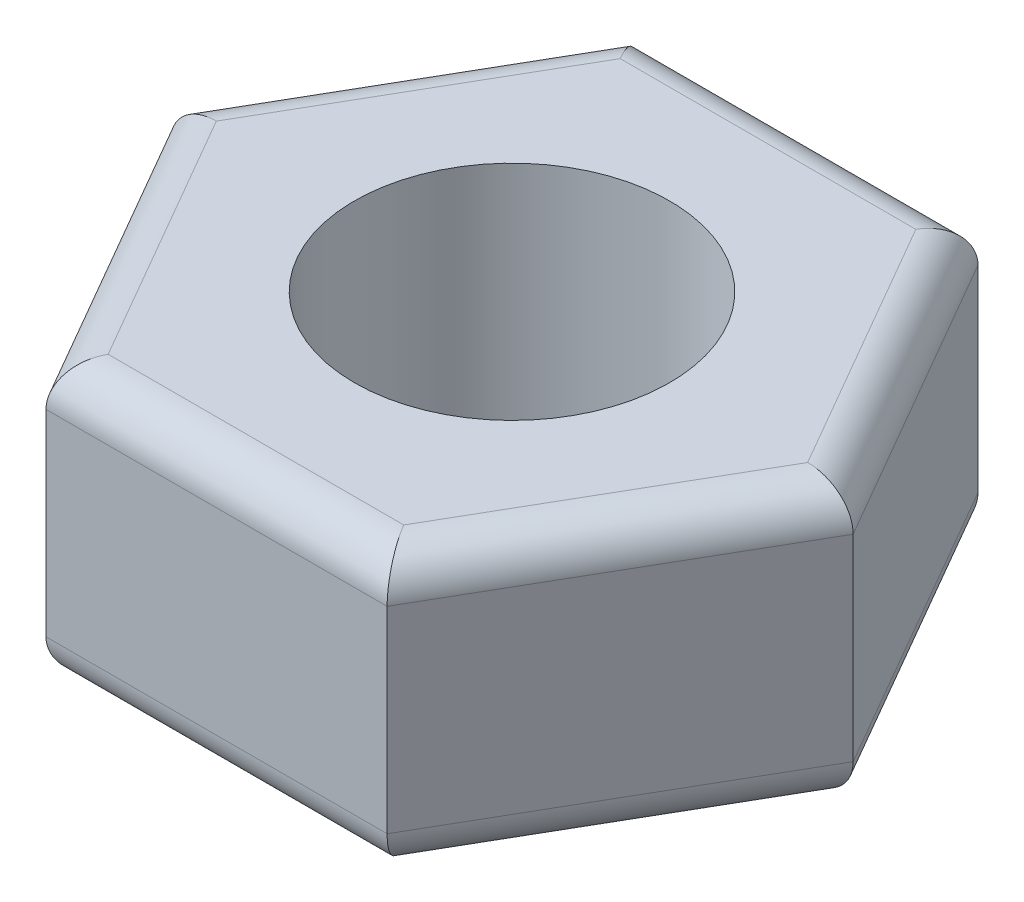
ISO-10303-21;
HEADER;
FILE_DESCRIPTION(('STEP AP214'),'2;1');
FILE_NAME('part.step','',(''),(''),'','','');
FILE_SCHEMA(('AUTOMOTIVE_DESIGN { 1 0 10303 214 1 1 1 1 }'));
ENDSEC;
DATA;
#1=APPLICATION_CONTEXT('core data for automotive mechanical design processes');
#2=APPLICATION_PROTOCOL_DEFINITION('international standard','automotive_design',2000,#1);
#3=PRODUCT_CONTEXT('',#1,'mechanical');
#4=PRODUCT('Part','Part','',(#3));
#5=PRODUCT_RELATED_PRODUCT_CATEGORY('part','',(#4));
#6=PRODUCT_DEFINITION_FORMATION('','',#4);
#7=PRODUCT_DEFINITION_CONTEXT('part definition',#1,'design');
#8=PRODUCT_DEFINITION('design','',#6,#7);
#9=PRODUCT_DEFINITION_SHAPE('','',#8);
#10=(LENGTH_UNIT() NAMED_UNIT(*) SI_UNIT(.MILLI.,.METRE.));
#11=(NAMED_UNIT(*) PLANE_ANGLE_UNIT() SI_UNIT($,.RADIAN.));
#12=(NAMED_UNIT(*) SI_UNIT($,.STERADIAN.) SOLID_ANGLE_UNIT());
#13=UNCERTAINTY_MEASURE_WITH_UNIT(LENGTH_MEASURE(1.E-05),#10,'distance_accuracy_value','');
#14=(GEOMETRIC_REPRESENTATION_CONTEXT(3) GLOBAL_UNCERTAINTY_ASSIGNED_CONTEXT((#13)) GLOBAL_UNIT_ASSIGNED_CONTEXT((#10,
#11,#12)) REPRESENTATION_CONTEXT('',''));
#15=CARTESIAN_POINT('',(0.,0.,0.));
#16=DIRECTION('',(0.,0.,1.));
#17=DIRECTION('',(1.,0.,0.));
#18=AXIS2_PLACEMENT_3D('',#15,#16,#17);
#19=CARTESIAN_POINT('',(0.,3.5,0.));
#20=DIRECTION('',(0.,1.,0.));
#21=DIRECTION('',(0.,0.,1.));
#22=AXIS2_PLACEMENT_3D('',#19,#20,#21);
#23=PLANE('',#22);
#24=DIRECTION('',(-1.,0.,0.));
#25=VECTOR('',#24,1.);
#26=CARTESIAN_POINT('',(-2.1650635094611,3.5,-3.25));
#27=LINE('',#26,#25);
#28=CARTESIAN_POINT('',(1.87638837486628,3.5,-3.25));
#29=VERTEX_POINT('',#28);
#30=CARTESIAN_POINT('',(-1.87638837486628,3.5,-3.25));
#31=VERTEX_POINT('',#30);
#32=EDGE_CURVE('E45',#29,#31,#27,.T.);
#33=ORIENTED_EDGE('',*,*,#32,.T.);
#34=DIRECTION('',(-0.5,0.,0.866025403784439));
#35=VECTOR('',#34,1.);
#36=CARTESIAN_POINT('',(-3.89711431702997,3.5,0.250000000000001));
#37=LINE('',#36,#35);
#38=CARTESIAN_POINT('',(-3.75277674973256,3.5,0.));
#39=VERTEX_POINT('',#38);
#40=EDGE_CURVE('E11',#31,#39,#37,.T.);
#41=ORIENTED_EDGE('',*,*,#40,.T.);
#42=DIRECTION('',(0.5,0.,0.866025403784438));
#43=VECTOR('',#42,1.);
#44=CARTESIAN_POINT('',(-1.73205080756887,3.5,3.5));
#45=LINE('',#44,#43);
#46=CARTESIAN_POINT('',(-1.87638837486628,3.5,3.25));
#47=VERTEX_POINT('',#46);
#48=EDGE_CURVE('E261',#39,#47,#45,.T.);
#49=ORIENTED_EDGE('',*,*,#48,.T.);
#50=DIRECTION('',(1.,0.,0.));
#51=VECTOR('',#50,1.);
#52=CARTESIAN_POINT('',(2.1650635094611,3.5,3.25));
#53=LINE('',#52,#51);
#54=CARTESIAN_POINT('',(1.87638837486628,3.5,3.25));
#55=VERTEX_POINT('',#54);
#56=EDGE_CURVE('E160',#47,#55,#53,.T.);
#57=ORIENTED_EDGE('',*,*,#56,.T.);
#58=DIRECTION('',(0.5,0.,-0.866025403784439));
#59=VECTOR('',#58,1.);
#60=CARTESIAN_POINT('',(3.89711431702997,3.5,-0.250000000000001));
#61=LINE('',#60,#59);
#62=CARTESIAN_POINT('',(3.75277674973257,3.5,0.));
#63=VERTEX_POINT('',#62);
#64=EDGE_CURVE('E257',#55,#63,#61,.T.);
#65=ORIENTED_EDGE('',*,*,#64,.T.);
#66=DIRECTION('',(-0.5,0.,-0.866025403784439));
#67=VECTOR('',#66,1.);
#68=CARTESIAN_POINT('',(1.73205080756888,3.5,-3.5));
#69=LINE('',#68,#67);
#70=EDGE_CURVE('E259',#63,#29,#69,.T.);
#71=ORIENTED_EDGE('',*,*,#70,.T.);
#72=EDGE_LOOP('',(#33,#41,#49,#57,#65,#71));
#73=FACE_BOUND('',#72,.T.);
#74=CARTESIAN_POINT('',(0.,3.5,0.));
#75=DIRECTION('',(0.,1.,0.));
#76=DIRECTION('',(0.,0.,1.));
#77=AXIS2_PLACEMENT_3D('',#74,#75,#76);
#78=CIRCLE('',#77,2.);
#79=CARTESIAN_POINT('',(0.,3.5,2.));
#80=VERTEX_POINT('',#79);
#81=EDGE_CURVE('E209',#80,#80,#78,.T.);
#82=ORIENTED_EDGE('',*,*,#81,.F.);
#83=EDGE_LOOP('',(#82));
#84=FACE_BOUND('',#83,.T.);
#85=ADVANCED_FACE('F36',(#73,#84),#23,.T.);
#86=CARTESIAN_POINT('',(0.,0.,0.));
#87=DIRECTION('',(0.,1.,0.));
#88=DIRECTION('',(0.,0.,1.));
#89=AXIS2_PLACEMENT_3D('',#86,#87,#88);
#90=PLANE('',#89);
#91=DIRECTION('',(1.,0.,0.));
#92=VECTOR('',#91,1.);
#93=CARTESIAN_POINT('',(0.,0.,3.25));
#94=LINE('',#93,#92);
#95=CARTESIAN_POINT('',(1.87638837486628,0.,3.25));
#96=VERTEX_POINT('',#95);
#97=CARTESIAN_POINT('',(-1.87638837486628,0.,3.25));
#98=VERTEX_POINT('',#97);
#99=EDGE_CURVE('E227',#96,#98,#94,.F.);
#100=ORIENTED_EDGE('',*,*,#99,.T.);
#101=DIRECTION('',(0.5,0.,0.866025403784438));
#102=VECTOR('',#101,1.);
#103=CARTESIAN_POINT('',(-2.81458256229942,0.,1.625));
#104=LINE('',#103,#102);
#105=CARTESIAN_POINT('',(-3.75277674973256,0.,0.));
#106=VERTEX_POINT('',#105);
#107=EDGE_CURVE('E237',#98,#106,#104,.F.);
#108=ORIENTED_EDGE('',*,*,#107,.T.);
#109=DIRECTION('',(-0.5,0.,0.866025403784439));
#110=VECTOR('',#109,1.);
#111=CARTESIAN_POINT('',(-2.81458256229943,0.,-1.625));
#112=LINE('',#111,#110);
#113=CARTESIAN_POINT('',(-1.87638837486628,0.,-3.25));
#114=VERTEX_POINT('',#113);
#115=EDGE_CURVE('E235',#106,#114,#112,.F.);
#116=ORIENTED_EDGE('',*,*,#115,.T.);
#117=DIRECTION('',(-1.,0.,0.));
#118=VECTOR('',#117,1.);
#119=CARTESIAN_POINT('',(0.,0.,-3.25));
#120=LINE('',#119,#118);
#121=CARTESIAN_POINT('',(1.87638837486628,0.,-3.25));
#122=VERTEX_POINT('',#121);
#123=EDGE_CURVE('E233',#114,#122,#120,.F.);
#124=ORIENTED_EDGE('',*,*,#123,.T.);
#125=DIRECTION('',(-0.5,0.,-0.866025403784439));
#126=VECTOR('',#125,1.);
#127=CARTESIAN_POINT('',(2.81458256229942,0.,-1.625));
#128=LINE('',#127,#126);
#129=CARTESIAN_POINT('',(3.75277674973257,0.,0.));
#130=VERTEX_POINT('',#129);
#131=EDGE_CURVE('E231',#122,#130,#128,.F.);
#132=ORIENTED_EDGE('',*,*,#131,.T.);
#133=DIRECTION('',(0.5,0.,-0.866025403784439));
#134=VECTOR('',#133,1.);
#135=CARTESIAN_POINT('',(2.81458256229943,0.,1.625));
#136=LINE('',#135,#134);
#137=EDGE_CURVE('E229',#130,#96,#136,.F.);
#138=ORIENTED_EDGE('',*,*,#137,.T.);
#139=EDGE_LOOP('',(#100,#108,#116,#124,#132,#138));
#140=FACE_BOUND('',#139,.T.);
#141=CARTESIAN_POINT('',(0.,0.,0.));
#142=DIRECTION('',(0.,1.,0.));
#143=DIRECTION('',(0.,0.,1.));
#144=AXIS2_PLACEMENT_3D('',#141,#142,#143);
#145=CIRCLE('',#144,2.);
#146=CARTESIAN_POINT('',(0.,0.,2.));
#147=VERTEX_POINT('',#146);
#148=EDGE_CURVE('E203',#147,#147,#145,.T.);
#149=ORIENTED_EDGE('',*,*,#148,.T.);
#150=EDGE_LOOP('',(#149));
#151=FACE_BOUND('',#150,.T.);
#152=ADVANCED_FACE('F300',(#140,#151),#90,.F.);
#153=CARTESIAN_POINT('',(4.33012701892219,3.5,0.));
#154=DIRECTION('',(-0.866025403784438,0.,0.5));
#155=DIRECTION('',(0.5,0.,0.866025403784439));
#156=AXIS2_PLACEMENT_3D('',#153,#154,#155);
#157=PLANE('',#156);
#158=DIRECTION('',(0.,-1.,0.));
#159=VECTOR('',#158,1.);
#160=CARTESIAN_POINT('',(4.33012701892219,3.5,0.));
#161=LINE('',#160,#159);
#162=CARTESIAN_POINT('',(4.33012701892219,3.,0.));
#163=VERTEX_POINT('',#162);
#164=CARTESIAN_POINT('',(4.33012701892219,0.5,0.));
#165=VERTEX_POINT('',#164);
#166=EDGE_CURVE('E214',#163,#165,#161,.T.);
#167=ORIENTED_EDGE('',*,*,#166,.T.);
#168=DIRECTION('',(-0.5,0.,-0.866025403784439));
#169=VECTOR('',#168,1.);
#170=CARTESIAN_POINT('',(4.33012701892219,0.5,0.));
#171=LINE('',#170,#169);
#172=CARTESIAN_POINT('',(2.1650635094611,0.5,-3.75));
#173=VERTEX_POINT('',#172);
#174=EDGE_CURVE('E250',#165,#173,#171,.T.);
#175=ORIENTED_EDGE('',*,*,#174,.T.);
#176=DIRECTION('',(0.,-1.,0.));
#177=VECTOR('',#176,1.);
#178=CARTESIAN_POINT('',(2.1650635094611,3.5,-3.75));
#179=LINE('',#178,#177);
#180=CARTESIAN_POINT('',(2.1650635094611,3.,-3.75));
#181=VERTEX_POINT('',#180);
#182=EDGE_CURVE('E157',#181,#173,#179,.T.);
#183=ORIENTED_EDGE('',*,*,#182,.F.);
#184=DIRECTION('',(-0.5,0.,-0.866025403784439));
#185=VECTOR('',#184,1.);
#186=CARTESIAN_POINT('',(4.33012701892219,3.,0.));
#187=LINE('',#186,#185);
#188=EDGE_CURVE('E248',#181,#163,#187,.F.);
#189=ORIENTED_EDGE('',*,*,#188,.T.);
#190=EDGE_LOOP('',(#167,#175,#183,#189));
#191=FACE_BOUND('',#190,.T.);
#192=ADVANCED_FACE('F305',(#191),#157,.F.);
#193=CARTESIAN_POINT('',(2.1650635094611,3.5,-3.75));
#194=DIRECTION('',(0.,0.,1.));
#195=DIRECTION('',(1.,0.,0.));
#196=AXIS2_PLACEMENT_3D('',#193,#194,#195);
#197=PLANE('',#196);
#198=ORIENTED_EDGE('',*,*,#182,.T.);
#199=DIRECTION('',(-1.,0.,0.));
#200=VECTOR('',#199,1.);
#201=CARTESIAN_POINT('',(2.1650635094611,0.5,-3.75));
#202=LINE('',#201,#200);
#203=CARTESIAN_POINT('',(-2.1650635094611,0.5,-3.75));
#204=VERTEX_POINT('',#203);
#205=EDGE_CURVE('E246',#173,#204,#202,.T.);
#206=ORIENTED_EDGE('',*,*,#205,.T.);
#207=DIRECTION('',(0.,-1.,0.));
#208=VECTOR('',#207,1.);
#209=CARTESIAN_POINT('',(-2.1650635094611,3.5,-3.75));
#210=LINE('',#209,#208);
#211=CARTESIAN_POINT('',(-2.1650635094611,3.,-3.75));
#212=VERTEX_POINT('',#211);
#213=EDGE_CURVE('E221',#212,#204,#210,.T.);
#214=ORIENTED_EDGE('',*,*,#213,.F.);
#215=DIRECTION('',(-1.,0.,0.));
#216=VECTOR('',#215,1.);
#217=CARTESIAN_POINT('',(2.1650635094611,3.,-3.75));
#218=LINE('',#217,#216);
#219=EDGE_CURVE('E244',#212,#181,#218,.F.);
#220=ORIENTED_EDGE('',*,*,#219,.T.);
#221=EDGE_LOOP('',(#198,#206,#214,#220));
#222=FACE_BOUND('',#221,.T.);
#223=ADVANCED_FACE('F280',(#222),#197,.F.);
#224=CARTESIAN_POINT('',(-2.1650635094611,3.5,-3.75));
#225=DIRECTION('',(0.866025403784439,0.,0.499999999999999));
#226=DIRECTION('',(0.5,0.,-0.866025403784439));
#227=AXIS2_PLACEMENT_3D('',#224,#225,#226);
#228=PLANE('',#227);
#229=ORIENTED_EDGE('',*,*,#213,.T.);
#230=DIRECTION('',(-0.5,0.,0.866025403784439));
#231=VECTOR('',#230,1.);
#232=CARTESIAN_POINT('',(-2.1650635094611,0.5,-3.75));
#233=LINE('',#232,#231);
#234=CARTESIAN_POINT('',(-4.33012701892219,0.5,0.));
#235=VERTEX_POINT('',#234);
#236=EDGE_CURVE('E242',#204,#235,#233,.T.);
#237=ORIENTED_EDGE('',*,*,#236,.T.);
#238=DIRECTION('',(0.,-1.,0.));
#239=VECTOR('',#238,1.);
#240=CARTESIAN_POINT('',(-4.33012701892219,3.5,0.));
#241=LINE('',#240,#239);
#242=CARTESIAN_POINT('',(-4.33012701892219,3.,0.));
#243=VERTEX_POINT('',#242);
#244=EDGE_CURVE('E148',#243,#235,#241,.T.);
#245=ORIENTED_EDGE('',*,*,#244,.F.);
#246=DIRECTION('',(-0.5,0.,0.866025403784439));
#247=VECTOR('',#246,1.);
#248=CARTESIAN_POINT('',(-2.1650635094611,3.,-3.75));
#249=LINE('',#248,#247);
#250=EDGE_CURVE('E240',#243,#212,#249,.F.);
#251=ORIENTED_EDGE('',*,*,#250,.T.);
#252=EDGE_LOOP('',(#229,#237,#245,#251));
#253=FACE_BOUND('',#252,.T.);
#254=ADVANCED_FACE('F277',(#253),#228,.F.);
#255=CARTESIAN_POINT('',(-4.33012701892219,3.5,0.));
#256=DIRECTION('',(0.866025403784438,0.,-0.5));
#257=DIRECTION('',(-0.5,0.,-0.866025403784438));
#258=AXIS2_PLACEMENT_3D('',#255,#256,#257);
#259=PLANE('',#258);
#260=ORIENTED_EDGE('',*,*,#244,.T.);
#261=DIRECTION('',(0.5,0.,0.866025403784438));
#262=VECTOR('',#261,1.);
#263=CARTESIAN_POINT('',(-4.33012701892219,0.5,0.));
#264=LINE('',#263,#262);
#265=CARTESIAN_POINT('',(-2.16506350946109,0.5,3.75));
#266=VERTEX_POINT('',#265);
#267=EDGE_CURVE('E147',#235,#266,#264,.T.);
#268=ORIENTED_EDGE('',*,*,#267,.T.);
#269=DIRECTION('',(0.,-1.,0.));
#270=VECTOR('',#269,1.);
#271=CARTESIAN_POINT('',(-2.16506350946109,3.5,3.75));
#272=LINE('',#271,#270);
#273=CARTESIAN_POINT('',(-2.16506350946109,3.,3.75));
#274=VERTEX_POINT('',#273);
#275=EDGE_CURVE('E128',#274,#266,#272,.T.);
#276=ORIENTED_EDGE('',*,*,#275,.F.);
#277=DIRECTION('',(0.5,0.,0.866025403784438));
#278=VECTOR('',#277,1.);
#279=CARTESIAN_POINT('',(-4.33012701892219,3.,0.));
#280=LINE('',#279,#278);
#281=EDGE_CURVE('E144',#274,#243,#280,.F.);
#282=ORIENTED_EDGE('',*,*,#281,.T.);
#283=EDGE_LOOP('',(#260,#268,#276,#282));
#284=FACE_BOUND('',#283,.T.);
#285=ADVANCED_FACE('F143',(#284),#259,.F.);
#286=CARTESIAN_POINT('',(-2.16506350946109,3.5,3.75));
#287=DIRECTION('',(0.,0.,-1.));
#288=DIRECTION('',(-1.,0.,0.));
#289=AXIS2_PLACEMENT_3D('',#286,#287,#288);
#290=PLANE('',#289);
#291=ORIENTED_EDGE('',*,*,#275,.T.);
#292=DIRECTION('',(1.,0.,0.));
#293=VECTOR('',#292,1.);
#294=CARTESIAN_POINT('',(-2.16506350946109,0.5,3.75));
#295=LINE('',#294,#293);
#296=CARTESIAN_POINT('',(2.1650635094611,0.5,3.75));
#297=VERTEX_POINT('',#296);
#298=EDGE_CURVE('E135',#266,#297,#295,.T.);
#299=ORIENTED_EDGE('',*,*,#298,.T.);
#300=DIRECTION('',(0.,-1.,0.));
#301=VECTOR('',#300,1.);
#302=CARTESIAN_POINT('',(2.1650635094611,3.5,3.75));
#303=LINE('',#302,#301);
#304=CARTESIAN_POINT('',(2.1650635094611,3.,3.75));
#305=VERTEX_POINT('',#304);
#306=EDGE_CURVE('E130',#305,#297,#303,.T.);
#307=ORIENTED_EDGE('',*,*,#306,.F.);
#308=DIRECTION('',(1.,0.,0.));
#309=VECTOR('',#308,1.);
#310=CARTESIAN_POINT('',(-2.16506350946109,3.,3.75));
#311=LINE('',#310,#309);
#312=EDGE_CURVE('E125',#305,#274,#311,.F.);
#313=ORIENTED_EDGE('',*,*,#312,.T.);
#314=EDGE_LOOP('',(#291,#299,#307,#313));
#315=FACE_BOUND('',#314,.T.);
#316=ADVANCED_FACE('F127',(#315),#290,.F.);
#317=CARTESIAN_POINT('',(2.1650635094611,3.5,3.75));
#318=DIRECTION('',(-0.866025403784439,0.,-0.5));
#319=DIRECTION('',(-0.5,0.,0.866025403784439));
#320=AXIS2_PLACEMENT_3D('',#317,#318,#319);
#321=PLANE('',#320);
#322=ORIENTED_EDGE('',*,*,#306,.T.);
#323=DIRECTION('',(0.5,0.,-0.866025403784439));
#324=VECTOR('',#323,1.);
#325=CARTESIAN_POINT('',(2.1650635094611,0.5,3.75));
#326=LINE('',#325,#324);
#327=EDGE_CURVE('E136',#297,#165,#326,.T.);
#328=ORIENTED_EDGE('',*,*,#327,.T.);
#329=ORIENTED_EDGE('',*,*,#166,.F.);
#330=DIRECTION('',(0.5,0.,-0.866025403784439));
#331=VECTOR('',#330,1.);
#332=CARTESIAN_POINT('',(2.1650635094611,3.,3.75));
#333=LINE('',#332,#331);
#334=EDGE_CURVE('E252',#163,#305,#333,.F.);
#335=ORIENTED_EDGE('',*,*,#334,.T.);
#336=EDGE_LOOP('',(#322,#328,#329,#335));
#337=FACE_BOUND('',#336,.T.);
#338=ADVANCED_FACE('F267',(#337),#321,.F.);
#339=CARTESIAN_POINT('',(0.,3.5,0.));
#340=DIRECTION('',(0.,-1.,0.));
#341=DIRECTION('',(0.,0.,-1.));
#342=AXIS2_PLACEMENT_3D('',#339,#340,#341);
#343=CYLINDRICAL_SURFACE('',#342,2.);
#344=ORIENTED_EDGE('',*,*,#81,.T.);
#345=EDGE_LOOP('',(#344));
#346=FACE_BOUND('',#345,.T.);
#347=ORIENTED_EDGE('',*,*,#148,.F.);
#348=EDGE_LOOP('',(#347));
#349=FACE_BOUND('',#348,.T.);
#350=ADVANCED_FACE('F309',(#346,#349),#343,.F.);
#351=CARTESIAN_POINT('',(3.89711431702997,0.5,0.249999999999999));
#352=DIRECTION('',(-0.5,0.,-0.866025403784439));
#353=DIRECTION('',(-0.866025403784438,0.,0.5));
#354=AXIS2_PLACEMENT_3D('',#351,#352,#353);
#355=CYLINDRICAL_SURFACE('',#354,0.5);
#356=CARTESIAN_POINT('',(3.75277674973257,0.5,0.));
#357=DIRECTION('',(0.,0.,-1.));
#358=DIRECTION('',(1.,0.,0.));
#359=AXIS2_PLACEMENT_3D('',#356,#357,#358);
#360=ELLIPSE('',#359,0.577350269189626,0.5);
#361=EDGE_CURVE('E196',#130,#165,#360,.F.);
#362=ORIENTED_EDGE('',*,*,#361,.F.);
#363=ORIENTED_EDGE('',*,*,#131,.F.);
#364=CARTESIAN_POINT('',(1.87638837486628,0.5,-3.25));
#365=DIRECTION('',(-0.866025403784439,0.,-0.5));
#366=DIRECTION('',(0.5,0.,-0.866025403784439));
#367=AXIS2_PLACEMENT_3D('',#364,#365,#366);
#368=ELLIPSE('',#367,0.577350269189626,0.5);
#369=EDGE_CURVE('E165',#173,#122,#368,.T.);
#370=ORIENTED_EDGE('',*,*,#369,.F.);
#371=ORIENTED_EDGE('',*,*,#174,.F.);
#372=EDGE_LOOP('',(#362,#363,#370,#371));
#373=FACE_BOUND('',#372,.T.);
#374=ADVANCED_FACE('F352',(#373),#355,.T.);
#375=CARTESIAN_POINT('',(2.1650635094611,0.5,-3.25));
#376=DIRECTION('',(-1.,0.,0.));
#377=DIRECTION('',(0.,0.,1.));
#378=AXIS2_PLACEMENT_3D('',#375,#376,#377);
#379=CYLINDRICAL_SURFACE('',#378,0.5);
#380=ORIENTED_EDGE('',*,*,#369,.T.);
#381=ORIENTED_EDGE('',*,*,#123,.F.);
#382=CARTESIAN_POINT('',(-1.87638837486628,0.5,-3.25));
#383=DIRECTION('',(-0.866025403784438,0.,0.5));
#384=DIRECTION('',(-0.5,0.,-0.866025403784439));
#385=AXIS2_PLACEMENT_3D('',#382,#383,#384);
#386=ELLIPSE('',#385,0.577350269189626,0.5);
#387=EDGE_CURVE('E194',#204,#114,#386,.T.);
#388=ORIENTED_EDGE('',*,*,#387,.F.);
#389=ORIENTED_EDGE('',*,*,#205,.F.);
#390=EDGE_LOOP('',(#380,#381,#388,#389));
#391=FACE_BOUND('',#390,.T.);
#392=ADVANCED_FACE('F282',(#391),#379,.T.);
#393=CARTESIAN_POINT('',(1.73205080756888,0.5,3.5));
#394=DIRECTION('',(0.5,0.,-0.866025403784439));
#395=DIRECTION('',(-0.866025403784439,0.,-0.5));
#396=AXIS2_PLACEMENT_3D('',#393,#394,#395);
#397=CYLINDRICAL_SURFACE('',#396,0.5);
#398=ORIENTED_EDGE('',*,*,#361,.T.);
#399=ORIENTED_EDGE('',*,*,#327,.F.);
#400=CARTESIAN_POINT('',(1.87638837486628,0.5,3.25));
#401=DIRECTION('',(0.866025403784438,0.,-0.5));
#402=DIRECTION('',(0.5,0.,0.866025403784438));
#403=AXIS2_PLACEMENT_3D('',#400,#401,#402);
#404=ELLIPSE('',#403,0.577350269189626,0.5);
#405=EDGE_CURVE('E188',#96,#297,#404,.F.);
#406=ORIENTED_EDGE('',*,*,#405,.F.);
#407=ORIENTED_EDGE('',*,*,#137,.F.);
#408=EDGE_LOOP('',(#398,#399,#406,#407));
#409=FACE_BOUND('',#408,.T.);
#410=ADVANCED_FACE('F365',(#409),#397,.T.);
#411=CARTESIAN_POINT('',(-1.73205080756888,0.5,-3.5));
#412=DIRECTION('',(-0.5,0.,0.866025403784439));
#413=DIRECTION('',(0.866025403784439,0.,0.499999999999999));
#414=AXIS2_PLACEMENT_3D('',#411,#412,#413);
#415=CYLINDRICAL_SURFACE('',#414,0.5);
#416=ORIENTED_EDGE('',*,*,#387,.T.);
#417=ORIENTED_EDGE('',*,*,#115,.F.);
#418=CARTESIAN_POINT('',(-3.75277674973257,0.5,0.));
#419=DIRECTION('',(0.,0.,1.));
#420=DIRECTION('',(-1.,0.,0.));
#421=AXIS2_PLACEMENT_3D('',#418,#419,#420);
#422=ELLIPSE('',#421,0.577350269189626,0.5);
#423=EDGE_CURVE('E182',#235,#106,#422,.T.);
#424=ORIENTED_EDGE('',*,*,#423,.F.);
#425=ORIENTED_EDGE('',*,*,#236,.F.);
#426=EDGE_LOOP('',(#416,#417,#424,#425));
#427=FACE_BOUND('',#426,.T.);
#428=ADVANCED_FACE('F287',(#427),#415,.T.);
#429=CARTESIAN_POINT('',(-2.16506350946109,0.5,3.25));
#430=DIRECTION('',(1.,0.,0.));
#431=DIRECTION('',(0.,0.,-1.));
#432=AXIS2_PLACEMENT_3D('',#429,#430,#431);
#433=CYLINDRICAL_SURFACE('',#432,0.5);
#434=ORIENTED_EDGE('',*,*,#405,.T.);
#435=ORIENTED_EDGE('',*,*,#298,.F.);
#436=CARTESIAN_POINT('',(-1.87638837486628,0.5,3.25));
#437=DIRECTION('',(0.866025403784439,0.,0.5));
#438=DIRECTION('',(0.5,0.,-0.866025403784439));
#439=AXIS2_PLACEMENT_3D('',#436,#437,#438);
#440=ELLIPSE('',#439,0.577350269189626,0.5);
#441=EDGE_CURVE('E178',#98,#266,#440,.F.);
#442=ORIENTED_EDGE('',*,*,#441,.F.);
#443=ORIENTED_EDGE('',*,*,#99,.F.);
#444=EDGE_LOOP('',(#434,#435,#442,#443));
#445=FACE_BOUND('',#444,.T.);
#446=ADVANCED_FACE('F290',(#445),#433,.T.);
#447=CARTESIAN_POINT('',(-3.89711431702997,0.5,-0.249999999999999));
#448=DIRECTION('',(0.5,0.,0.866025403784438));
#449=DIRECTION('',(0.866025403784438,0.,-0.5));
#450=AXIS2_PLACEMENT_3D('',#447,#448,#449);
#451=CYLINDRICAL_SURFACE('',#450,0.5);
#452=ORIENTED_EDGE('',*,*,#423,.T.);
#453=ORIENTED_EDGE('',*,*,#107,.F.);
#454=ORIENTED_EDGE('',*,*,#441,.T.);
#455=ORIENTED_EDGE('',*,*,#267,.F.);
#456=EDGE_LOOP('',(#452,#453,#454,#455));
#457=FACE_BOUND('',#456,.T.);
#458=ADVANCED_FACE('F288',(#457),#451,.T.);
#459=CARTESIAN_POINT('',(2.81458256229942,3.,-1.625));
#460=DIRECTION('',(0.5,0.,0.866025403784439));
#461=DIRECTION('',(0.866025403784438,0.,-0.5));
#462=AXIS2_PLACEMENT_3D('',#459,#460,#461);
#463=CYLINDRICAL_SURFACE('',#462,0.5);
#464=CARTESIAN_POINT('',(3.75277674973257,3.,0.));
#465=DIRECTION('',(0.,0.,1.));
#466=DIRECTION('',(-1.,0.,0.));
#467=AXIS2_PLACEMENT_3D('',#464,#465,#466);
#468=ELLIPSE('',#467,0.577350269189626,0.5);
#469=EDGE_CURVE('E171',#163,#63,#468,.T.);
#470=ORIENTED_EDGE('',*,*,#469,.F.);
#471=ORIENTED_EDGE('',*,*,#188,.F.);
#472=CARTESIAN_POINT('',(1.87638837486628,3.,-3.25));
#473=DIRECTION('',(0.866025403784439,0.,0.5));
#474=DIRECTION('',(0.5,0.,-0.866025403784439));
#475=AXIS2_PLACEMENT_3D('',#472,#473,#474);
#476=ELLIPSE('',#475,0.577350269189626,0.5);
#477=EDGE_CURVE('E40',#29,#181,#476,.F.);
#478=ORIENTED_EDGE('',*,*,#477,.F.);
#479=ORIENTED_EDGE('',*,*,#70,.F.);
#480=EDGE_LOOP('',(#470,#471,#478,#479));
#481=FACE_BOUND('',#480,.T.);
#482=ADVANCED_FACE('F38',(#481),#463,.T.);
#483=CARTESIAN_POINT('',(0.,3.,-3.25));
#484=DIRECTION('',(1.,0.,0.));
#485=DIRECTION('',(0.,0.,-1.));
#486=AXIS2_PLACEMENT_3D('',#483,#484,#485);
#487=CYLINDRICAL_SURFACE('',#486,0.5);
#488=ORIENTED_EDGE('',*,*,#477,.T.);
#489=ORIENTED_EDGE('',*,*,#219,.F.);
#490=CARTESIAN_POINT('',(-1.87638837486628,3.,-3.25));
#491=DIRECTION('',(0.866025403784438,0.,-0.5));
#492=DIRECTION('',(0.5,0.,0.866025403784439));
#493=AXIS2_PLACEMENT_3D('',#490,#491,#492);
#494=ELLIPSE('',#493,0.577350269189626,0.5);
#495=EDGE_CURVE('E169',#31,#212,#494,.F.);
#496=ORIENTED_EDGE('',*,*,#495,.F.);
#497=ORIENTED_EDGE('',*,*,#32,.F.);
#498=EDGE_LOOP('',(#488,#489,#496,#497));
#499=FACE_BOUND('',#498,.T.);
#500=ADVANCED_FACE('F272',(#499),#487,.T.);
#501=CARTESIAN_POINT('',(2.81458256229943,3.,1.625));
#502=DIRECTION('',(-0.5,0.,0.866025403784439));
#503=DIRECTION('',(0.866025403784439,0.,0.5));
#504=AXIS2_PLACEMENT_3D('',#501,#502,#503);
#505=CYLINDRICAL_SURFACE('',#504,0.5);
#506=ORIENTED_EDGE('',*,*,#469,.T.);
#507=ORIENTED_EDGE('',*,*,#64,.F.);
#508=CARTESIAN_POINT('',(1.87638837486628,3.,3.25));
#509=DIRECTION('',(-0.866025403784438,0.,0.5));
#510=DIRECTION('',(-0.5,0.,-0.866025403784438));
#511=AXIS2_PLACEMENT_3D('',#508,#509,#510);
#512=ELLIPSE('',#511,0.577350269189626,0.5);
#513=EDGE_CURVE('E162',#305,#55,#512,.T.);
#514=ORIENTED_EDGE('',*,*,#513,.F.);
#515=ORIENTED_EDGE('',*,*,#334,.F.);
#516=EDGE_LOOP('',(#506,#507,#514,#515));
#517=FACE_BOUND('',#516,.T.);
#518=ADVANCED_FACE('F264',(#517),#505,.T.);
#519=CARTESIAN_POINT('',(-2.81458256229943,3.,-1.625));
#520=DIRECTION('',(0.5,0.,-0.866025403784439));
#521=DIRECTION('',(-0.866025403784439,0.,-0.499999999999999));
#522=AXIS2_PLACEMENT_3D('',#519,#520,#521);
#523=CYLINDRICAL_SURFACE('',#522,0.5);
#524=ORIENTED_EDGE('',*,*,#495,.T.);
#525=ORIENTED_EDGE('',*,*,#250,.F.);
#526=CARTESIAN_POINT('',(-3.75277674973257,3.,0.));
#527=DIRECTION('',(0.,0.,-1.));
#528=DIRECTION('',(1.,0.,0.));
#529=AXIS2_PLACEMENT_3D('',#526,#527,#528);
#530=ELLIPSE('',#529,0.577350269189626,0.5);
#531=EDGE_CURVE('E155',#39,#243,#530,.F.);
#532=ORIENTED_EDGE('',*,*,#531,.F.);
#533=ORIENTED_EDGE('',*,*,#40,.F.);
#534=EDGE_LOOP('',(#524,#525,#532,#533));
#535=FACE_BOUND('',#534,.T.);
#536=ADVANCED_FACE('F274',(#535),#523,.T.);
#537=CARTESIAN_POINT('',(0.,3.,3.25));
#538=DIRECTION('',(-1.,0.,0.));
#539=DIRECTION('',(0.,0.,1.));
#540=AXIS2_PLACEMENT_3D('',#537,#538,#539);
#541=CYLINDRICAL_SURFACE('',#540,0.5);
#542=ORIENTED_EDGE('',*,*,#513,.T.);
#543=ORIENTED_EDGE('',*,*,#56,.F.);
#544=CARTESIAN_POINT('',(-1.87638837486628,3.,3.25));
#545=DIRECTION('',(-0.866025403784439,0.,-0.5));
#546=DIRECTION('',(-0.5,0.,0.866025403784439));
#547=AXIS2_PLACEMENT_3D('',#544,#545,#546);
#548=ELLIPSE('',#547,0.577350269189626,0.5);
#549=EDGE_CURVE('E153',#274,#47,#548,.T.);
#550=ORIENTED_EDGE('',*,*,#549,.F.);
#551=ORIENTED_EDGE('',*,*,#312,.F.);
#552=EDGE_LOOP('',(#542,#543,#550,#551));
#553=FACE_BOUND('',#552,.T.);
#554=ADVANCED_FACE('F159',(#553),#541,.T.);
#555=CARTESIAN_POINT('',(-2.81458256229942,3.,1.625));
#556=DIRECTION('',(-0.5,0.,-0.866025403784438));
#557=DIRECTION('',(-0.866025403784438,0.,0.5));
#558=AXIS2_PLACEMENT_3D('',#555,#556,#557);
#559=CYLINDRICAL_SURFACE('',#558,0.5);
#560=ORIENTED_EDGE('',*,*,#531,.T.);
#561=ORIENTED_EDGE('',*,*,#281,.F.);
#562=ORIENTED_EDGE('',*,*,#549,.T.);
#563=ORIENTED_EDGE('',*,*,#48,.F.);
#564=EDGE_LOOP('',(#560,#561,#562,#563));
#565=FACE_BOUND('',#564,.T.);
#566=ADVANCED_FACE('F151',(#565),#559,.T.);
#567=CLOSED_SHELL('',(#85,#152,#192,#223,#254,#285,#316,#338,#350,#374,#392,#410,#428,#446,#458,
#482,#500,#518,#536,#554,#566));
#568=MANIFOLD_SOLID_BREP('B2',#567);
#569=ADVANCED_BREP_SHAPE_REPRESENTATION('',(#18,#568),#14);
#570=SHAPE_DEFINITION_REPRESENTATION(#9,#569);
ENDSEC;
END-ISO-10303-21;
